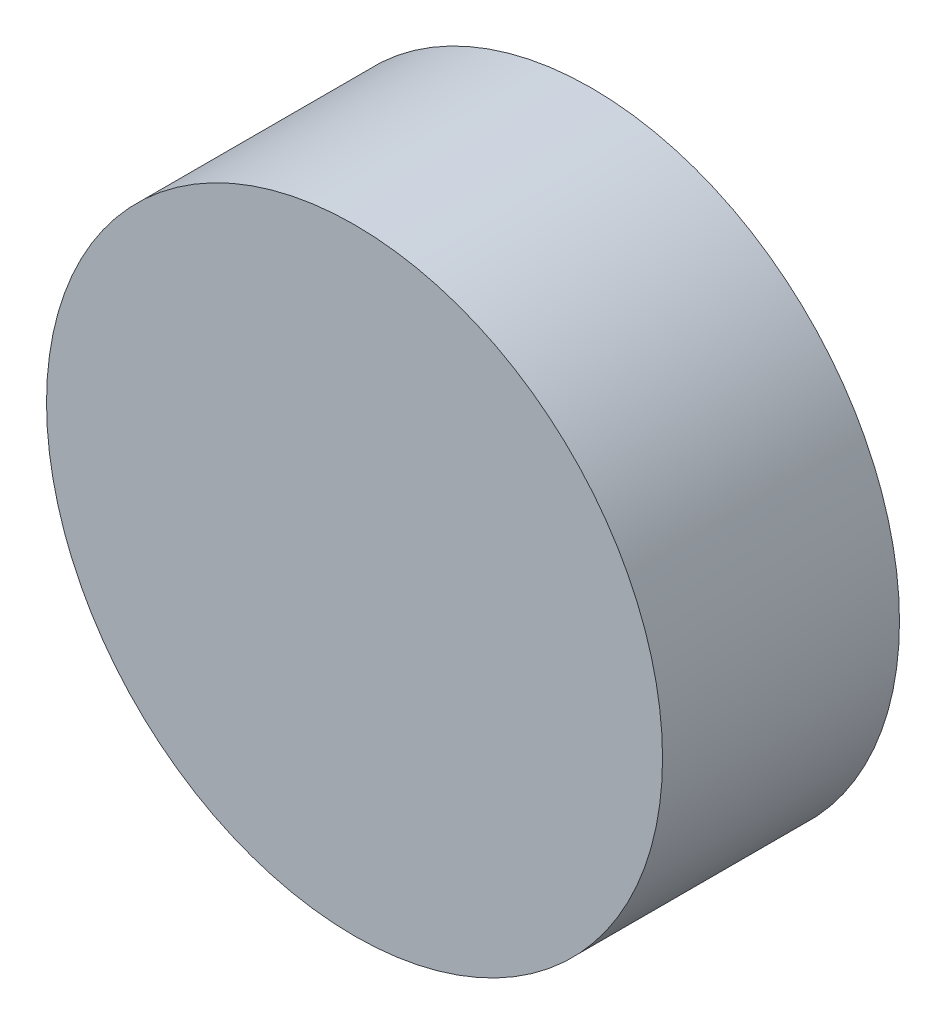
ISO-10303-21;
HEADER;
FILE_DESCRIPTION(('STEP AP214'),'2;1');
FILE_NAME('part.step','',(''),(''),'','','');
FILE_SCHEMA(('AUTOMOTIVE_DESIGN { 1 0 10303 214 1 1 1 1 }'));
ENDSEC;
DATA;
#1=APPLICATION_CONTEXT('core data for automotive mechanical design processes');
#2=APPLICATION_PROTOCOL_DEFINITION('international standard','automotive_design',2000,#1);
#3=PRODUCT_CONTEXT('',#1,'mechanical');
#4=PRODUCT('Part','Part','',(#3));
#5=PRODUCT_RELATED_PRODUCT_CATEGORY('part','',(#4));
#6=PRODUCT_DEFINITION_FORMATION('','',#4);
#7=PRODUCT_DEFINITION_CONTEXT('part definition',#1,'design');
#8=PRODUCT_DEFINITION('design','',#6,#7);
#9=PRODUCT_DEFINITION_SHAPE('','',#8);
#10=(LENGTH_UNIT() NAMED_UNIT(*) SI_UNIT(.MILLI.,.METRE.));
#11=(NAMED_UNIT(*) PLANE_ANGLE_UNIT() SI_UNIT($,.RADIAN.));
#12=(NAMED_UNIT(*) SI_UNIT($,.STERADIAN.) SOLID_ANGLE_UNIT());
#13=UNCERTAINTY_MEASURE_WITH_UNIT(LENGTH_MEASURE(1.E-05),#10,'distance_accuracy_value','');
#14=(GEOMETRIC_REPRESENTATION_CONTEXT(3) GLOBAL_UNCERTAINTY_ASSIGNED_CONTEXT((#13)) GLOBAL_UNIT_ASSIGNED_CONTEXT((#10,
#11,#12)) REPRESENTATION_CONTEXT('',''));
#15=CARTESIAN_POINT('',(0.,0.,0.));
#16=DIRECTION('',(0.,0.,1.));
#17=DIRECTION('',(1.,0.,0.));
#18=AXIS2_PLACEMENT_3D('',#15,#16,#17);
#19=CARTESIAN_POINT('',(0.,0.,25.));
#20=DIRECTION('',(0.,0.,-1.));
#21=DIRECTION('',(-1.,0.,0.));
#22=AXIS2_PLACEMENT_3D('',#19,#20,#21);
#23=CYLINDRICAL_SURFACE('',#22,32.5);
#24=CARTESIAN_POINT('',(0.,0.,25.));
#25=DIRECTION('',(0.,0.,1.));
#26=DIRECTION('',(1.,0.,0.));
#27=AXIS2_PLACEMENT_3D('',#24,#25,#26);
#28=CIRCLE('',#27,32.5);
#29=CARTESIAN_POINT('',(32.5,0.,25.));
#30=VERTEX_POINT('',#29);
#31=EDGE_CURVE('E10',#30,#30,#28,.T.);
#32=ORIENTED_EDGE('',*,*,#31,.F.);
#33=EDGE_LOOP('',(#32));
#34=FACE_BOUND('',#33,.T.);
#35=CARTESIAN_POINT('',(0.,0.,0.));
#36=DIRECTION('',(0.,0.,1.));
#37=DIRECTION('',(1.,0.,0.));
#38=AXIS2_PLACEMENT_3D('',#35,#36,#37);
#39=CIRCLE('',#38,32.5);
#40=CARTESIAN_POINT('',(32.5,0.,0.));
#41=VERTEX_POINT('',#40);
#42=EDGE_CURVE('E35',#41,#41,#39,.T.);
#43=ORIENTED_EDGE('',*,*,#42,.T.);
#44=EDGE_LOOP('',(#43));
#45=FACE_BOUND('',#44,.T.);
#46=ADVANCED_FACE('F32',(#34,#45),#23,.T.);
#47=CARTESIAN_POINT('',(0.,0.,25.));
#48=DIRECTION('',(0.,0.,1.));
#49=DIRECTION('',(1.,0.,0.));
#50=AXIS2_PLACEMENT_3D('',#47,#48,#49);
#51=PLANE('',#50);
#52=ORIENTED_EDGE('',*,*,#31,.T.);
#53=EDGE_LOOP('',(#52));
#54=FACE_BOUND('',#53,.T.);
#55=ADVANCED_FACE('F47',(#54),#51,.T.);
#56=CARTESIAN_POINT('',(0.,0.,0.));
#57=DIRECTION('',(0.,0.,1.));
#58=DIRECTION('',(1.,0.,0.));
#59=AXIS2_PLACEMENT_3D('',#56,#57,#58);
#60=PLANE('',#59);
#61=ORIENTED_EDGE('',*,*,#42,.F.);
#62=EDGE_LOOP('',(#61));
#63=FACE_BOUND('',#62,.T.);
#64=ADVANCED_FACE('F45',(#63),#60,.F.);
#65=CLOSED_SHELL('',(#46,#55,#64));
#66=MANIFOLD_SOLID_BREP('B2',#65);
#67=ADVANCED_BREP_SHAPE_REPRESENTATION('',(#18,#66),#14);
#68=SHAPE_DEFINITION_REPRESENTATION(#9,#67);
ENDSEC;
END-ISO-10303-21;
